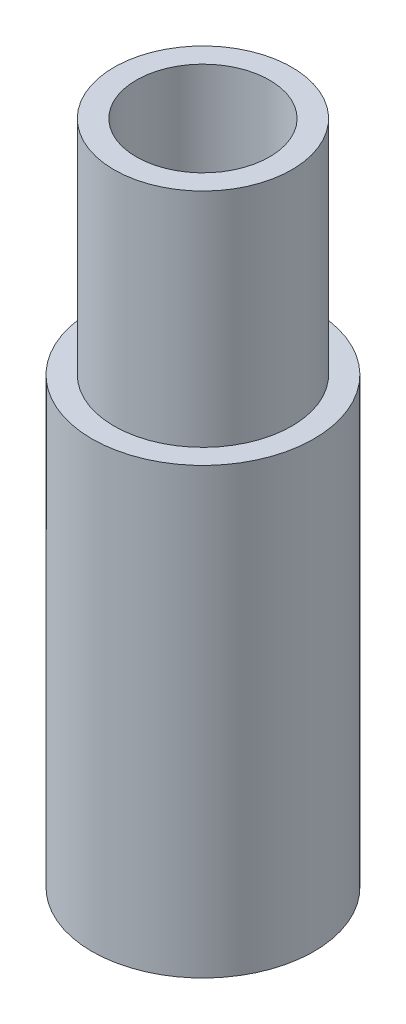
ISO-10303-21;
HEADER;
FILE_DESCRIPTION(('STEP AP214'),'2;1');
FILE_NAME('part.step','',(''),(''),'','','');
FILE_SCHEMA(('AUTOMOTIVE_DESIGN { 1 0 10303 214 1 1 1 1 }'));
ENDSEC;
DATA;
#1=APPLICATION_CONTEXT('core data for automotive mechanical design processes');
#2=APPLICATION_PROTOCOL_DEFINITION('international standard','automotive_design',2000,#1);
#3=PRODUCT_CONTEXT('',#1,'mechanical');
#4=PRODUCT('Part','Part','',(#3));
#5=PRODUCT_RELATED_PRODUCT_CATEGORY('part','',(#4));
#6=PRODUCT_DEFINITION_FORMATION('','',#4);
#7=PRODUCT_DEFINITION_CONTEXT('part definition',#1,'design');
#8=PRODUCT_DEFINITION('design','',#6,#7);
#9=PRODUCT_DEFINITION_SHAPE('','',#8);
#10=(LENGTH_UNIT() NAMED_UNIT(*) SI_UNIT(.MILLI.,.METRE.));
#11=(NAMED_UNIT(*) PLANE_ANGLE_UNIT() SI_UNIT($,.RADIAN.));
#12=(NAMED_UNIT(*) SI_UNIT($,.STERADIAN.) SOLID_ANGLE_UNIT());
#13=UNCERTAINTY_MEASURE_WITH_UNIT(LENGTH_MEASURE(1.E-05),#10,'distance_accuracy_value','');
#14=(GEOMETRIC_REPRESENTATION_CONTEXT(3) GLOBAL_UNCERTAINTY_ASSIGNED_CONTEXT((#13)) GLOBAL_UNIT_ASSIGNED_CONTEXT((#10,
#11,#12)) REPRESENTATION_CONTEXT('',''));
#15=CARTESIAN_POINT('',(0.,0.,0.));
#16=DIRECTION('',(0.,0.,1.));
#17=DIRECTION('',(1.,0.,0.));
#18=AXIS2_PLACEMENT_3D('',#15,#16,#17);
#19=CARTESIAN_POINT('',(0.,20.,0.));
#20=DIRECTION('',(0.,-1.,0.));
#21=DIRECTION('',(0.,0.,-1.));
#22=AXIS2_PLACEMENT_3D('',#19,#20,#21);
#23=CYLINDRICAL_SURFACE('',#22,5.);
#24=CARTESIAN_POINT('',(0.,20.,0.));
#25=DIRECTION('',(0.,1.,0.));
#26=DIRECTION('',(0.,0.,1.));
#27=AXIS2_PLACEMENT_3D('',#24,#25,#26);
#28=CIRCLE('',#27,5.);
#29=CARTESIAN_POINT('',(0.,20.,5.));
#30=VERTEX_POINT('',#29);
#31=EDGE_CURVE('E45',#30,#30,#28,.T.);
#32=ORIENTED_EDGE('',*,*,#31,.F.);
#33=EDGE_LOOP('',(#32));
#34=FACE_BOUND('',#33,.T.);
#35=CARTESIAN_POINT('',(0.,0.,0.));
#36=DIRECTION('',(0.,1.,0.));
#37=DIRECTION('',(0.,0.,1.));
#38=AXIS2_PLACEMENT_3D('',#35,#36,#37);
#39=CIRCLE('',#38,5.);
#40=CARTESIAN_POINT('',(0.,0.,5.));
#41=VERTEX_POINT('',#40);
#42=EDGE_CURVE('E40',#41,#41,#39,.T.);
#43=ORIENTED_EDGE('',*,*,#42,.T.);
#44=EDGE_LOOP('',(#43));
#45=FACE_BOUND('',#44,.T.);
#46=ADVANCED_FACE('F37',(#34,#45),#23,.T.);
#47=CARTESIAN_POINT('',(0.,20.,0.));
#48=DIRECTION('',(0.,1.,0.));
#49=DIRECTION('',(0.,0.,1.));
#50=AXIS2_PLACEMENT_3D('',#47,#48,#49);
#51=PLANE('',#50);
#52=CARTESIAN_POINT('',(0.,20.,0.));
#53=DIRECTION('',(0.,1.,0.));
#54=DIRECTION('',(0.,0.,1.));
#55=AXIS2_PLACEMENT_3D('',#52,#53,#54);
#56=CIRCLE('',#55,4.00347820586737);
#57=CARTESIAN_POINT('',(0.,20.,4.00347820586737));
#58=VERTEX_POINT('',#57);
#59=EDGE_CURVE('E10',#58,#58,#56,.T.);
#60=ORIENTED_EDGE('',*,*,#59,.F.);
#61=EDGE_LOOP('',(#60));
#62=FACE_BOUND('',#61,.T.);
#63=ORIENTED_EDGE('',*,*,#31,.T.);
#64=EDGE_LOOP('',(#63));
#65=FACE_BOUND('',#64,.T.);
#66=ADVANCED_FACE('F80',(#62,#65),#51,.T.);
#67=CARTESIAN_POINT('',(0.,0.,0.));
#68=DIRECTION('',(0.,1.,0.));
#69=DIRECTION('',(0.,0.,1.));
#70=AXIS2_PLACEMENT_3D('',#67,#68,#69);
#71=PLANE('',#70);
#72=ORIENTED_EDGE('',*,*,#42,.F.);
#73=EDGE_LOOP('',(#72));
#74=FACE_BOUND('',#73,.T.);
#75=ADVANCED_FACE('F75',(#74),#71,.F.);
#76=CARTESIAN_POINT('',(0.,30.,0.));
#77=DIRECTION('',(0.,-1.,0.));
#78=DIRECTION('',(0.,0.,-1.));
#79=AXIS2_PLACEMENT_3D('',#76,#77,#78);
#80=CYLINDRICAL_SURFACE('',#79,4.00347820586737);
#81=CARTESIAN_POINT('',(0.,30.,0.));
#82=DIRECTION('',(0.,1.,0.));
#83=DIRECTION('',(0.,0.,1.));
#84=AXIS2_PLACEMENT_3D('',#81,#82,#83);
#85=CIRCLE('',#84,4.00347820586737);
#86=CARTESIAN_POINT('',(0.,30.,4.00347820586737));
#87=VERTEX_POINT('',#86);
#88=EDGE_CURVE('E52',#87,#87,#85,.T.);
#89=ORIENTED_EDGE('',*,*,#88,.F.);
#90=EDGE_LOOP('',(#89));
#91=FACE_BOUND('',#90,.T.);
#92=ORIENTED_EDGE('',*,*,#59,.T.);
#93=EDGE_LOOP('',(#92));
#94=FACE_BOUND('',#93,.T.);
#95=ADVANCED_FACE('F70',(#91,#94),#80,.T.);
#96=CARTESIAN_POINT('',(0.,30.,0.));
#97=DIRECTION('',(0.,1.,0.));
#98=DIRECTION('',(0.,0.,1.));
#99=AXIS2_PLACEMENT_3D('',#96,#97,#98);
#100=PLANE('',#99);
#101=CARTESIAN_POINT('',(0.,30.,0.));
#102=DIRECTION('',(0.,1.,0.));
#103=DIRECTION('',(0.,0.,1.));
#104=AXIS2_PLACEMENT_3D('',#101,#102,#103);
#105=CIRCLE('',#104,3.);
#106=CARTESIAN_POINT('',(0.,30.,3.));
#107=VERTEX_POINT('',#106);
#108=EDGE_CURVE('E60',#107,#107,#105,.T.);
#109=ORIENTED_EDGE('',*,*,#108,.F.);
#110=EDGE_LOOP('',(#109));
#111=FACE_BOUND('',#110,.T.);
#112=ORIENTED_EDGE('',*,*,#88,.T.);
#113=EDGE_LOOP('',(#112));
#114=FACE_BOUND('',#113,.T.);
#115=ADVANCED_FACE('F67',(#111,#114),#100,.T.);
#116=CARTESIAN_POINT('',(0.,11.5147186257614,0.));
#117=DIRECTION('',(0.,1.,0.));
#118=DIRECTION('',(0.,0.,1.));
#119=AXIS2_PLACEMENT_3D('',#116,#117,#118);
#120=CYLINDRICAL_SURFACE('',#119,3.);
#121=CARTESIAN_POINT('',(0.,20.,0.));
#122=DIRECTION('',(0.,1.,0.));
#123=DIRECTION('',(0.,0.,1.));
#124=AXIS2_PLACEMENT_3D('',#121,#122,#123);
#125=CIRCLE('',#124,3.);
#126=CARTESIAN_POINT('',(0.,20.,3.));
#127=VERTEX_POINT('',#126);
#128=EDGE_CURVE('E56',#127,#127,#125,.F.);
#129=ORIENTED_EDGE('',*,*,#128,.T.);
#130=EDGE_LOOP('',(#129));
#131=FACE_BOUND('',#130,.T.);
#132=ORIENTED_EDGE('',*,*,#108,.T.);
#133=EDGE_LOOP('',(#132));
#134=FACE_BOUND('',#133,.T.);
#135=ADVANCED_FACE('F65',(#131,#134),#120,.F.);
#136=CARTESIAN_POINT('',(0.,20.,0.));
#137=DIRECTION('',(0.,1.,0.));
#138=DIRECTION('',(0.,0.,1.));
#139=AXIS2_PLACEMENT_3D('',#136,#137,#138);
#140=PLANE('',#139);
#141=ORIENTED_EDGE('',*,*,#128,.F.);
#142=EDGE_LOOP('',(#141));
#143=FACE_BOUND('',#142,.T.);
#144=ADVANCED_FACE('F126',(#143),#140,.T.);
#145=CLOSED_SHELL('',(#46,#66,#75,#95,#115,#135,#144));
#146=MANIFOLD_SOLID_BREP('B2',#145);
#147=ADVANCED_BREP_SHAPE_REPRESENTATION('',(#18,#146),#14);
#148=SHAPE_DEFINITION_REPRESENTATION(#9,#147);
ENDSEC;
END-ISO-10303-21;
